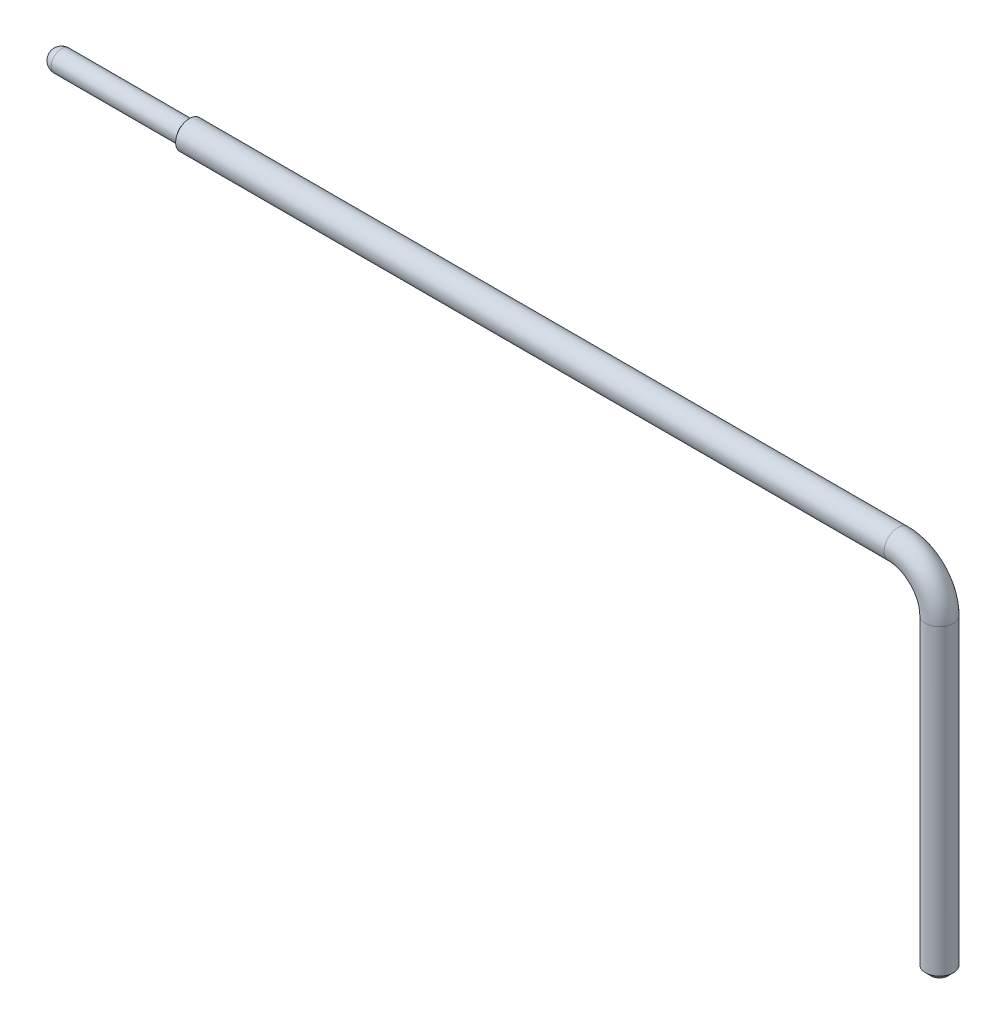
ISO-10303-21;
HEADER;
FILE_DESCRIPTION(('STEP AP214'),'2;1');
FILE_NAME('part.step','',(''),(''),'','','');
FILE_SCHEMA(('AUTOMOTIVE_DESIGN { 1 0 10303 214 1 1 1 1 }'));
ENDSEC;
DATA;
#1=APPLICATION_CONTEXT('core data for automotive mechanical design processes');
#2=APPLICATION_PROTOCOL_DEFINITION('international standard','automotive_design',2000,#1);
#3=PRODUCT_CONTEXT('',#1,'mechanical');
#4=PRODUCT('Part','Part','',(#3));
#5=PRODUCT_RELATED_PRODUCT_CATEGORY('part','',(#4));
#6=PRODUCT_DEFINITION_FORMATION('','',#4);
#7=PRODUCT_DEFINITION_CONTEXT('part definition',#1,'design');
#8=PRODUCT_DEFINITION('design','',#6,#7);
#9=PRODUCT_DEFINITION_SHAPE('','',#8);
#10=(LENGTH_UNIT() NAMED_UNIT(*) SI_UNIT(.MILLI.,.METRE.));
#11=(NAMED_UNIT(*) PLANE_ANGLE_UNIT() SI_UNIT($,.RADIAN.));
#12=(NAMED_UNIT(*) SI_UNIT($,.STERADIAN.) SOLID_ANGLE_UNIT());
#13=UNCERTAINTY_MEASURE_WITH_UNIT(LENGTH_MEASURE(1.E-05),#10,'distance_accuracy_value','');
#14=(GEOMETRIC_REPRESENTATION_CONTEXT(3) GLOBAL_UNCERTAINTY_ASSIGNED_CONTEXT((#13)) GLOBAL_UNIT_ASSIGNED_CONTEXT((#10,
#11,#12)) REPRESENTATION_CONTEXT('',''));
#15=CARTESIAN_POINT('',(0.,0.,0.));
#16=DIRECTION('',(0.,0.,1.));
#17=DIRECTION('',(1.,0.,0.));
#18=AXIS2_PLACEMENT_3D('',#15,#16,#17);
#19=CARTESIAN_POINT('',(0.,-6.41875,0.));
#20=DIRECTION('',(0.,1.,0.));
#21=DIRECTION('',(0.,0.,1.));
#22=AXIS2_PLACEMENT_3D('',#19,#20,#21);
#23=PLANE('',#22);
#24=CARTESIAN_POINT('',(0.,-6.41874999996617,0.));
#25=DIRECTION('',(0.,1.,0.));
#26=DIRECTION('',(-1.,0.,0.));
#27=AXIS2_PLACEMENT_3D('',#24,#25,#26);
#28=CIRCLE('',#27,0.155000000006567);
#29=CARTESIAN_POINT('',(-0.155000000006566,-6.41874999996617,0.));
#30=VERTEX_POINT('',#29);
#31=EDGE_CURVE('E20',#30,#30,#28,.T.);
#32=ORIENTED_EDGE('',*,*,#31,.F.);
#33=EDGE_LOOP('',(#32));
#34=FACE_BOUND('',#33,.T.);
#35=ADVANCED_FACE('F17',(#34),#23,.F.);
#36=CARTESIAN_POINT('',(-16.12,-2.17261486230513E-13,0.));
#37=DIRECTION('',(1.,0.,0.));
#38=DIRECTION('',(0.,0.,-1.));
#39=AXIS2_PLACEMENT_3D('',#36,#37,#38);
#40=SPHERICAL_SURFACE('',#39,0.19);
#41=CARTESIAN_POINT('',(-16.31,-2.17261486230513E-13,0.));
#42=VERTEX_POINT('',#41);
#43=VERTEX_LOOP('',#42);
#44=FACE_BOUND('',#43,.T.);
#45=CARTESIAN_POINT('',(-16.12,-2.17261486230513E-13,0.));
#46=DIRECTION('',(-1.,0.,0.));
#47=DIRECTION('',(0.,-1.,0.));
#48=AXIS2_PLACEMENT_3D('',#45,#46,#47);
#49=CIRCLE('',#48,0.19);
#50=CARTESIAN_POINT('',(-16.12,-0.190000000000217,0.));
#51=VERTEX_POINT('',#50);
#52=EDGE_CURVE('E34',#51,#51,#49,.F.);
#53=ORIENTED_EDGE('',*,*,#52,.F.);
#54=EDGE_LOOP('',(#53));
#55=FACE_BOUND('',#54,.T.);
#56=ADVANCED_FACE('F28',(#44,#55),#40,.T.);
#57=CARTESIAN_POINT('',(0.,-6.31874999987758,0.));
#58=DIRECTION('',(0.,1.,0.));
#59=DIRECTION('',(-1.,0.,0.));
#60=AXIS2_PLACEMENT_3D('',#57,#58,#59);
#61=CONICAL_SURFACE('',#60,0.255000000095151,0.785398163397448);
#62=CARTESIAN_POINT('',(0.,-6.31875,0.));
#63=DIRECTION('',(0.,-1.,0.));
#64=DIRECTION('',(0.,0.,-1.));
#65=AXIS2_PLACEMENT_3D('',#62,#63,#64);
#66=CIRCLE('',#65,0.255);
#67=CARTESIAN_POINT('',(0.,-6.31875,-0.255));
#68=VERTEX_POINT('',#67);
#69=EDGE_CURVE('E36',#68,#68,#66,.F.);
#70=ORIENTED_EDGE('',*,*,#69,.F.);
#71=EDGE_LOOP('',(#70));
#72=FACE_BOUND('',#71,.T.);
#73=ORIENTED_EDGE('',*,*,#31,.T.);
#74=EDGE_LOOP('',(#73));
#75=FACE_BOUND('',#74,.T.);
#76=ADVANCED_FACE('F31',(#72,#75),#61,.T.);
#77=CARTESIAN_POINT('',(-13.77,-1.84009868896362E-13,0.));
#78=DIRECTION('',(-1.,0.,0.));
#79=DIRECTION('',(0.,-1.,0.));
#80=AXIS2_PLACEMENT_3D('',#77,#78,#79);
#81=CYLINDRICAL_SURFACE('',#80,0.19);
#82=CARTESIAN_POINT('',(-13.8200000000097,-1.84717350116375E-13,0.));
#83=DIRECTION('',(1.,0.,0.));
#84=DIRECTION('',(0.,1.,0.));
#85=AXIS2_PLACEMENT_3D('',#82,#83,#84);
#86=CIRCLE('',#85,0.189999999975228);
#87=CARTESIAN_POINT('',(-13.8200000000097,0.189999999975043,0.));
#88=VERTEX_POINT('',#87);
#89=EDGE_CURVE('E39',#88,#88,#86,.T.);
#90=ORIENTED_EDGE('',*,*,#89,.F.);
#91=EDGE_LOOP('',(#90));
#92=FACE_BOUND('',#91,.T.);
#93=ORIENTED_EDGE('',*,*,#52,.T.);
#94=EDGE_LOOP('',(#93));
#95=FACE_BOUND('',#94,.T.);
#96=ADVANCED_FACE('F74',(#92,#95),#81,.T.);
#97=CARTESIAN_POINT('',(0.,-0.762000000000006,0.));
#98=DIRECTION('',(0.,-1.,0.));
#99=DIRECTION('',(0.,0.,-1.));
#100=AXIS2_PLACEMENT_3D('',#97,#98,#99);
#101=CYLINDRICAL_SURFACE('',#100,0.255);
#102=ORIENTED_EDGE('',*,*,#69,.T.);
#103=EDGE_LOOP('',(#102));
#104=FACE_BOUND('',#103,.T.);
#105=CARTESIAN_POINT('',(0.,-0.762,0.));
#106=DIRECTION('',(0.,1.,0.));
#107=DIRECTION('',(1.,0.,0.));
#108=AXIS2_PLACEMENT_3D('',#105,#106,#107);
#109=CIRCLE('',#108,0.255);
#110=CARTESIAN_POINT('',(0.255,-0.762,0.));
#111=VERTEX_POINT('',#110);
#112=EDGE_CURVE('E46',#111,#111,#109,.T.);
#113=ORIENTED_EDGE('',*,*,#112,.F.);
#114=EDGE_LOOP('',(#113));
#115=FACE_BOUND('',#114,.T.);
#116=ADVANCED_FACE('F70',(#104,#115),#101,.T.);
#117=CARTESIAN_POINT('',(-13.7700000000791,-1.84016213725102E-13,0.));
#118=DIRECTION('',(1.,0.,0.));
#119=DIRECTION('',(0.,1.,0.));
#120=AXIS2_PLACEMENT_3D('',#117,#118,#119);
#121=CONICAL_SURFACE('',#120,0.239999999905833,0.785398163397439);
#122=ORIENTED_EDGE('',*,*,#89,.T.);
#123=EDGE_LOOP('',(#122));
#124=FACE_BOUND('',#123,.T.);
#125=CARTESIAN_POINT('',(-13.7700000000223,-1.84016213724075E-13,0.));
#126=DIRECTION('',(1.,0.,0.));
#127=DIRECTION('',(0.,1.,0.));
#128=AXIS2_PLACEMENT_3D('',#125,#126,#127);
#129=CIRCLE('',#128,0.239999999962681);
#130=CARTESIAN_POINT('',(-13.7700000000223,0.239999999962497,0.));
#131=VERTEX_POINT('',#130);
#132=EDGE_CURVE('E44',#131,#131,#129,.T.);
#133=ORIENTED_EDGE('',*,*,#132,.F.);
#134=EDGE_LOOP('',(#133));
#135=FACE_BOUND('',#134,.T.);
#136=ADVANCED_FACE('F65',(#124,#135),#121,.T.);
#137=CARTESIAN_POINT('',(-0.762,-0.762,0.));
#138=DIRECTION('',(0.,0.,1.));
#139=DIRECTION('',(1.,0.,0.));
#140=AXIS2_PLACEMENT_3D('',#137,#138,#139);
#141=TOROIDAL_SURFACE('',#140,0.762,0.255);
#142=CARTESIAN_POINT('',(-0.762000000000002,0.,0.));
#143=DIRECTION('',(-1.,0.,0.));
#144=DIRECTION('',(0.,-1.,0.));
#145=AXIS2_PLACEMENT_3D('',#142,#143,#144);
#146=CIRCLE('',#145,0.255);
#147=CARTESIAN_POINT('',(-0.762000000000002,-0.255,0.));
#148=VERTEX_POINT('',#147);
#149=EDGE_CURVE('E24',#148,#148,#146,.T.);
#150=ORIENTED_EDGE('',*,*,#149,.F.);
#151=EDGE_LOOP('',(#150));
#152=FACE_BOUND('',#151,.T.);
#153=ORIENTED_EDGE('',*,*,#112,.T.);
#154=EDGE_LOOP('',(#153));
#155=FACE_BOUND('',#154,.T.);
#156=ADVANCED_FACE('F60',(#152,#155),#141,.T.);
#157=CARTESIAN_POINT('',(-13.77,-3.08187500000008,0.));
#158=DIRECTION('',(-1.,0.,0.));
#159=DIRECTION('',(0.,-1.,0.));
#160=AXIS2_PLACEMENT_3D('',#157,#158,#159);
#161=PLANE('',#160);
#162=CARTESIAN_POINT('',(-13.77,0.,0.));
#163=DIRECTION('',(-1.,0.,0.));
#164=DIRECTION('',(0.,-1.,0.));
#165=AXIS2_PLACEMENT_3D('',#162,#163,#164);
#166=CIRCLE('',#165,0.255);
#167=CARTESIAN_POINT('',(-13.77,-0.255,0.));
#168=VERTEX_POINT('',#167);
#169=EDGE_CURVE('E11',#168,#168,#166,.F.);
#170=ORIENTED_EDGE('',*,*,#169,.F.);
#171=EDGE_LOOP('',(#170));
#172=FACE_BOUND('',#171,.T.);
#173=ORIENTED_EDGE('',*,*,#132,.T.);
#174=EDGE_LOOP('',(#173));
#175=FACE_BOUND('',#174,.T.);
#176=ADVANCED_FACE('F64',(#172,#175),#161,.T.);
#177=CARTESIAN_POINT('',(-0.762000000000005,0.,0.));
#178=DIRECTION('',(-1.,0.,0.));
#179=DIRECTION('',(0.,-1.,0.));
#180=AXIS2_PLACEMENT_3D('',#177,#178,#179);
#181=CYLINDRICAL_SURFACE('',#180,0.255);
#182=ORIENTED_EDGE('',*,*,#169,.T.);
#183=EDGE_LOOP('',(#182));
#184=FACE_BOUND('',#183,.T.);
#185=ORIENTED_EDGE('',*,*,#149,.T.);
#186=EDGE_LOOP('',(#185));
#187=FACE_BOUND('',#186,.T.);
#188=ADVANCED_FACE('F86',(#184,#187),#181,.T.);
#189=CLOSED_SHELL('',(#35,#56,#76,#96,#116,#136,#156,#176,#188));
#190=MANIFOLD_SOLID_BREP('B1',#189);
#191=ADVANCED_BREP_SHAPE_REPRESENTATION('',(#18,#190),#14);
#192=SHAPE_DEFINITION_REPRESENTATION(#9,#191);
ENDSEC;
END-ISO-10303-21;
